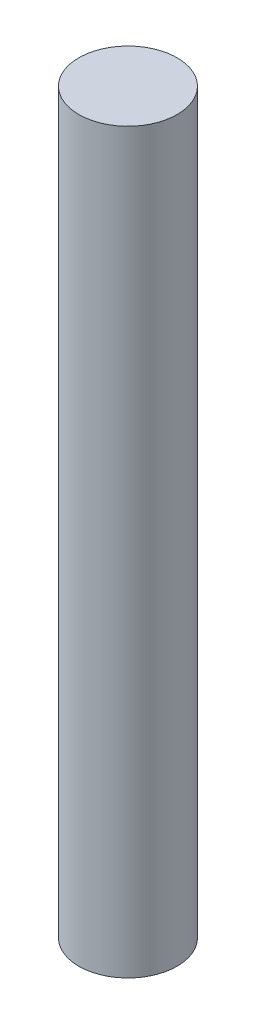
ISO-10303-21;
HEADER;
FILE_DESCRIPTION(('STEP AP214'),'2;1');
FILE_NAME('part.step','',(''),(''),'','','');
FILE_SCHEMA(('AUTOMOTIVE_DESIGN { 1 0 10303 214 1 1 1 1 }'));
ENDSEC;
DATA;
#1=APPLICATION_CONTEXT('core data for automotive mechanical design processes');
#2=APPLICATION_PROTOCOL_DEFINITION('international standard','automotive_design',2000,#1);
#3=PRODUCT_CONTEXT('',#1,'mechanical');
#4=PRODUCT('Part','Part','',(#3));
#5=PRODUCT_RELATED_PRODUCT_CATEGORY('part','',(#4));
#6=PRODUCT_DEFINITION_FORMATION('','',#4);
#7=PRODUCT_DEFINITION_CONTEXT('part definition',#1,'design');
#8=PRODUCT_DEFINITION('design','',#6,#7);
#9=PRODUCT_DEFINITION_SHAPE('','',#8);
#10=(LENGTH_UNIT() NAMED_UNIT(*) SI_UNIT(.MILLI.,.METRE.));
#11=(NAMED_UNIT(*) PLANE_ANGLE_UNIT() SI_UNIT($,.RADIAN.));
#12=(NAMED_UNIT(*) SI_UNIT($,.STERADIAN.) SOLID_ANGLE_UNIT());
#13=UNCERTAINTY_MEASURE_WITH_UNIT(LENGTH_MEASURE(1.E-05),#10,'distance_accuracy_value','');
#14=(GEOMETRIC_REPRESENTATION_CONTEXT(3) GLOBAL_UNCERTAINTY_ASSIGNED_CONTEXT((#13)) GLOBAL_UNIT_ASSIGNED_CONTEXT((#10,
#11,#12)) REPRESENTATION_CONTEXT('',''));
#15=CARTESIAN_POINT('',(0.,0.,0.));
#16=DIRECTION('',(0.,0.,1.));
#17=DIRECTION('',(1.,0.,0.));
#18=AXIS2_PLACEMENT_3D('',#15,#16,#17);
#19=CARTESIAN_POINT('',(0.,75.,0.));
#20=DIRECTION('',(0.,-1.,0.));
#21=DIRECTION('',(0.,0.,-1.));
#22=AXIS2_PLACEMENT_3D('',#19,#20,#21);
#23=CYLINDRICAL_SURFACE('',#22,5.);
#24=CARTESIAN_POINT('',(0.,75.,0.));
#25=DIRECTION('',(0.,1.,0.));
#26=DIRECTION('',(0.,0.,1.));
#27=AXIS2_PLACEMENT_3D('',#24,#25,#26);
#28=CIRCLE('',#27,5.);
#29=CARTESIAN_POINT('',(0.,75.,5.));
#30=VERTEX_POINT('',#29);
#31=EDGE_CURVE('E10',#30,#30,#28,.T.);
#32=ORIENTED_EDGE('',*,*,#31,.F.);
#33=EDGE_LOOP('',(#32));
#34=FACE_BOUND('',#33,.T.);
#35=CARTESIAN_POINT('',(0.,0.,0.));
#36=DIRECTION('',(0.,1.,0.));
#37=DIRECTION('',(0.,0.,1.));
#38=AXIS2_PLACEMENT_3D('',#35,#36,#37);
#39=CIRCLE('',#38,5.);
#40=CARTESIAN_POINT('',(0.,0.,5.));
#41=VERTEX_POINT('',#40);
#42=EDGE_CURVE('E34',#41,#41,#39,.T.);
#43=ORIENTED_EDGE('',*,*,#42,.T.);
#44=EDGE_LOOP('',(#43));
#45=FACE_BOUND('',#44,.T.);
#46=ADVANCED_FACE('F31',(#34,#45),#23,.T.);
#47=CARTESIAN_POINT('',(0.,75.,0.));
#48=DIRECTION('',(0.,1.,0.));
#49=DIRECTION('',(0.,0.,1.));
#50=AXIS2_PLACEMENT_3D('',#47,#48,#49);
#51=PLANE('',#50);
#52=ORIENTED_EDGE('',*,*,#31,.T.);
#53=EDGE_LOOP('',(#52));
#54=FACE_BOUND('',#53,.T.);
#55=ADVANCED_FACE('F46',(#54),#51,.T.);
#56=CARTESIAN_POINT('',(0.,0.,0.));
#57=DIRECTION('',(0.,1.,0.));
#58=DIRECTION('',(0.,0.,1.));
#59=AXIS2_PLACEMENT_3D('',#56,#57,#58);
#60=PLANE('',#59);
#61=ORIENTED_EDGE('',*,*,#42,.F.);
#62=EDGE_LOOP('',(#61));
#63=FACE_BOUND('',#62,.T.);
#64=ADVANCED_FACE('F44',(#63),#60,.F.);
#65=CLOSED_SHELL('',(#46,#55,#64));
#66=MANIFOLD_SOLID_BREP('B2',#65);
#67=ADVANCED_BREP_SHAPE_REPRESENTATION('',(#18,#66),#14);
#68=SHAPE_DEFINITION_REPRESENTATION(#9,#67);
ENDSEC;
END-ISO-10303-21;
